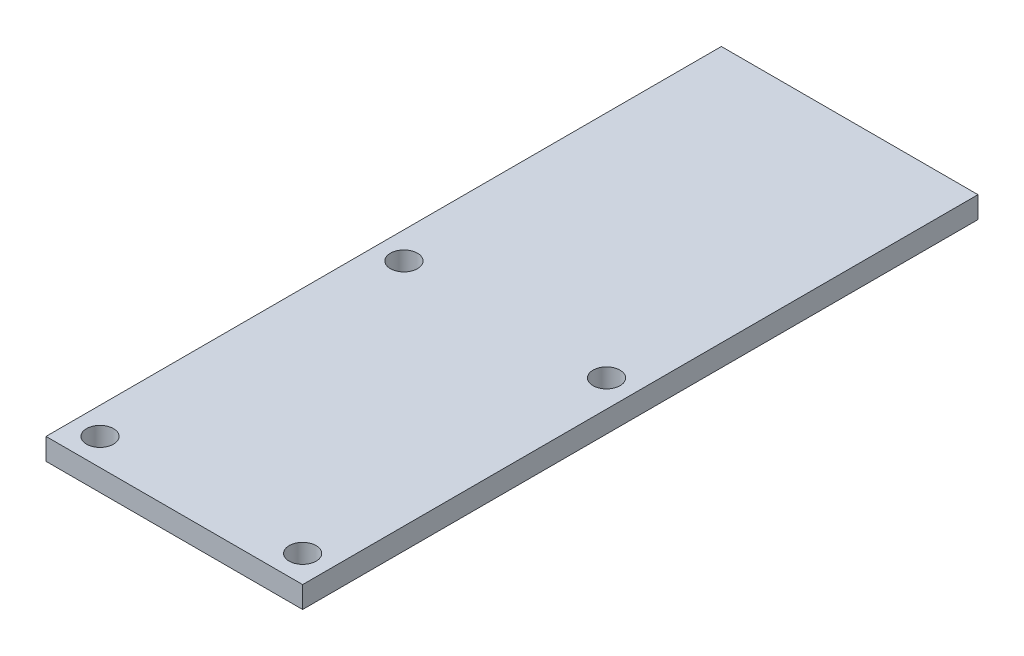
ISO-10303-21;
HEADER;
FILE_DESCRIPTION(('STEP AP214'),'2;1');
FILE_NAME('part.step','',(''),(''),'','','');
FILE_SCHEMA(('AUTOMOTIVE_DESIGN { 1 0 10303 214 1 1 1 1 }'));
ENDSEC;
DATA;
#1=APPLICATION_CONTEXT('core data for automotive mechanical design processes');
#2=APPLICATION_PROTOCOL_DEFINITION('international standard','automotive_design',2000,#1);
#3=PRODUCT_CONTEXT('',#1,'mechanical');
#4=PRODUCT('Part','Part','',(#3));
#5=PRODUCT_RELATED_PRODUCT_CATEGORY('part','',(#4));
#6=PRODUCT_DEFINITION_FORMATION('','',#4);
#7=PRODUCT_DEFINITION_CONTEXT('part definition',#1,'design');
#8=PRODUCT_DEFINITION('design','',#6,#7);
#9=PRODUCT_DEFINITION_SHAPE('','',#8);
#10=(LENGTH_UNIT() NAMED_UNIT(*) SI_UNIT(.MILLI.,.METRE.));
#11=(NAMED_UNIT(*) PLANE_ANGLE_UNIT() SI_UNIT($,.RADIAN.));
#12=(NAMED_UNIT(*) SI_UNIT($,.STERADIAN.) SOLID_ANGLE_UNIT());
#13=UNCERTAINTY_MEASURE_WITH_UNIT(LENGTH_MEASURE(1.E-05),#10,'distance_accuracy_value','');
#14=(GEOMETRIC_REPRESENTATION_CONTEXT(3) GLOBAL_UNCERTAINTY_ASSIGNED_CONTEXT((#13)) GLOBAL_UNIT_ASSIGNED_CONTEXT((#10,
#11,#12)) REPRESENTATION_CONTEXT('',''));
#15=CARTESIAN_POINT('',(0.,0.,0.));
#16=DIRECTION('',(0.,0.,1.));
#17=DIRECTION('',(1.,0.,0.));
#18=AXIS2_PLACEMENT_3D('',#15,#16,#17);
#19=CARTESIAN_POINT('',(0.,1.6,0.));
#20=DIRECTION('',(0.,-1.,0.));
#21=DIRECTION('',(0.,0.,-1.));
#22=AXIS2_PLACEMENT_3D('',#19,#20,#21);
#23=PLANE('',#22);
#24=CARTESIAN_POINT('',(17.,1.6,-24.5));
#25=DIRECTION('',(0.,1.,0.));
#26=DIRECTION('',(0.,0.,1.));
#27=AXIS2_PLACEMENT_3D('',#24,#25,#26);
#28=CIRCLE('',#27,1.);
#29=CARTESIAN_POINT('',(17.,1.6,-23.5));
#30=VERTEX_POINT('',#29);
#31=EDGE_CURVE('E125',#30,#30,#28,.T.);
#32=ORIENTED_EDGE('',*,*,#31,.F.);
#33=EDGE_LOOP('',(#32));
#34=FACE_BOUND('',#33,.T.);
#35=CARTESIAN_POINT('',(2.00000000000001,1.6,-2.00000000000001));
#36=DIRECTION('',(0.,1.,0.));
#37=DIRECTION('',(0.,0.,1.));
#38=AXIS2_PLACEMENT_3D('',#35,#36,#37);
#39=CIRCLE('',#38,1.);
#40=CARTESIAN_POINT('',(2.00000000000001,1.6,-1.00000000000001));
#41=VERTEX_POINT('',#40);
#42=EDGE_CURVE('E104',#41,#41,#39,.T.);
#43=ORIENTED_EDGE('',*,*,#42,.F.);
#44=EDGE_LOOP('',(#43));
#45=FACE_BOUND('',#44,.T.);
#46=DIRECTION('',(0.,0.,1.));
#47=VECTOR('',#46,1.);
#48=CARTESIAN_POINT('',(0.,1.6,0.));
#49=LINE('',#48,#47);
#50=CARTESIAN_POINT('',(0.,1.6,-50.));
#51=VERTEX_POINT('',#50);
#52=CARTESIAN_POINT('',(0.,1.6,0.));
#53=VERTEX_POINT('',#52);
#54=EDGE_CURVE('E89',#51,#53,#49,.T.);
#55=ORIENTED_EDGE('',*,*,#54,.T.);
#56=DIRECTION('',(1.,0.,0.));
#57=VECTOR('',#56,1.);
#58=CARTESIAN_POINT('',(0.,1.6,0.));
#59=LINE('',#58,#57);
#60=CARTESIAN_POINT('',(19.,1.6,0.));
#61=VERTEX_POINT('',#60);
#62=EDGE_CURVE('E84',#53,#61,#59,.T.);
#63=ORIENTED_EDGE('',*,*,#62,.T.);
#64=DIRECTION('',(0.,0.,-1.));
#65=VECTOR('',#64,1.);
#66=CARTESIAN_POINT('',(19.,1.6,0.));
#67=LINE('',#66,#65);
#68=CARTESIAN_POINT('',(19.,1.6,-50.));
#69=VERTEX_POINT('',#68);
#70=EDGE_CURVE('E87',#61,#69,#67,.T.);
#71=ORIENTED_EDGE('',*,*,#70,.T.);
#72=DIRECTION('',(-1.,0.,0.));
#73=VECTOR('',#72,1.);
#74=CARTESIAN_POINT('',(0.,1.6,-50.));
#75=LINE('',#74,#73);
#76=EDGE_CURVE('E54',#69,#51,#75,.T.);
#77=ORIENTED_EDGE('',*,*,#76,.T.);
#78=EDGE_LOOP('',(#55,#63,#71,#77));
#79=FACE_BOUND('',#78,.T.);
#80=CARTESIAN_POINT('',(2.,1.6,-24.5));
#81=DIRECTION('',(0.,1.,0.));
#82=DIRECTION('',(0.,0.,1.));
#83=AXIS2_PLACEMENT_3D('',#80,#81,#82);
#84=CIRCLE('',#83,1.);
#85=CARTESIAN_POINT('',(2.,1.6,-23.5));
#86=VERTEX_POINT('',#85);
#87=EDGE_CURVE('E119',#86,#86,#84,.T.);
#88=ORIENTED_EDGE('',*,*,#87,.F.);
#89=EDGE_LOOP('',(#88));
#90=FACE_BOUND('',#89,.T.);
#91=CARTESIAN_POINT('',(17.,1.6,-2.));
#92=DIRECTION('',(0.,1.,0.));
#93=DIRECTION('',(0.,0.,1.));
#94=AXIS2_PLACEMENT_3D('',#91,#92,#93);
#95=CIRCLE('',#94,1.);
#96=CARTESIAN_POINT('',(17.,1.6,-0.999999999999999));
#97=VERTEX_POINT('',#96);
#98=EDGE_CURVE('E131',#97,#97,#95,.T.);
#99=ORIENTED_EDGE('',*,*,#98,.F.);
#100=EDGE_LOOP('',(#99));
#101=FACE_BOUND('',#100,.T.);
#102=ADVANCED_FACE('F37',(#34,#45,#79,#90,#101),#23,.F.);
#103=CARTESIAN_POINT('',(0.,0.,0.));
#104=DIRECTION('',(0.,-1.,0.));
#105=DIRECTION('',(0.,0.,-1.));
#106=AXIS2_PLACEMENT_3D('',#103,#104,#105);
#107=PLANE('',#106);
#108=CARTESIAN_POINT('',(17.,0.,-24.5));
#109=DIRECTION('',(0.,1.,0.));
#110=DIRECTION('',(0.,0.,1.));
#111=AXIS2_PLACEMENT_3D('',#108,#109,#110);
#112=CIRCLE('',#111,1.);
#113=CARTESIAN_POINT('',(17.,0.,-23.5));
#114=VERTEX_POINT('',#113);
#115=EDGE_CURVE('E128',#114,#114,#112,.T.);
#116=ORIENTED_EDGE('',*,*,#115,.T.);
#117=EDGE_LOOP('',(#116));
#118=FACE_BOUND('',#117,.T.);
#119=CARTESIAN_POINT('',(2.00000000000001,0.,-2.00000000000001));
#120=DIRECTION('',(0.,1.,0.));
#121=DIRECTION('',(0.,0.,1.));
#122=AXIS2_PLACEMENT_3D('',#119,#120,#121);
#123=CIRCLE('',#122,1.);
#124=CARTESIAN_POINT('',(2.00000000000001,0.,-1.00000000000001));
#125=VERTEX_POINT('',#124);
#126=EDGE_CURVE('E116',#125,#125,#123,.T.);
#127=ORIENTED_EDGE('',*,*,#126,.T.);
#128=EDGE_LOOP('',(#127));
#129=FACE_BOUND('',#128,.T.);
#130=DIRECTION('',(0.,0.,1.));
#131=VECTOR('',#130,1.);
#132=CARTESIAN_POINT('',(0.,0.,0.));
#133=LINE('',#132,#131);
#134=CARTESIAN_POINT('',(0.,0.,-50.));
#135=VERTEX_POINT('',#134);
#136=CARTESIAN_POINT('',(0.,0.,0.));
#137=VERTEX_POINT('',#136);
#138=EDGE_CURVE('E101',#135,#137,#133,.T.);
#139=ORIENTED_EDGE('',*,*,#138,.F.);
#140=DIRECTION('',(-1.,0.,0.));
#141=VECTOR('',#140,1.);
#142=CARTESIAN_POINT('',(0.,0.,-50.));
#143=LINE('',#142,#141);
#144=CARTESIAN_POINT('',(19.,0.,-50.));
#145=VERTEX_POINT('',#144);
#146=EDGE_CURVE('E77',#145,#135,#143,.T.);
#147=ORIENTED_EDGE('',*,*,#146,.F.);
#148=DIRECTION('',(0.,0.,-1.));
#149=VECTOR('',#148,1.);
#150=CARTESIAN_POINT('',(19.,0.,0.));
#151=LINE('',#150,#149);
#152=CARTESIAN_POINT('',(19.,0.,0.));
#153=VERTEX_POINT('',#152);
#154=EDGE_CURVE('E71',#153,#145,#151,.T.);
#155=ORIENTED_EDGE('',*,*,#154,.F.);
#156=DIRECTION('',(1.,0.,0.));
#157=VECTOR('',#156,1.);
#158=CARTESIAN_POINT('',(0.,0.,0.));
#159=LINE('',#158,#157);
#160=EDGE_CURVE('E93',#137,#153,#159,.T.);
#161=ORIENTED_EDGE('',*,*,#160,.F.);
#162=EDGE_LOOP('',(#139,#147,#155,#161));
#163=FACE_BOUND('',#162,.T.);
#164=CARTESIAN_POINT('',(2.,0.,-24.5));
#165=DIRECTION('',(0.,1.,0.));
#166=DIRECTION('',(0.,0.,1.));
#167=AXIS2_PLACEMENT_3D('',#164,#165,#166);
#168=CIRCLE('',#167,1.);
#169=CARTESIAN_POINT('',(2.,0.,-23.5));
#170=VERTEX_POINT('',#169);
#171=EDGE_CURVE('E122',#170,#170,#168,.T.);
#172=ORIENTED_EDGE('',*,*,#171,.T.);
#173=EDGE_LOOP('',(#172));
#174=FACE_BOUND('',#173,.T.);
#175=CARTESIAN_POINT('',(17.,0.,-2.));
#176=DIRECTION('',(0.,1.,0.));
#177=DIRECTION('',(0.,0.,1.));
#178=AXIS2_PLACEMENT_3D('',#175,#176,#177);
#179=CIRCLE('',#178,1.);
#180=CARTESIAN_POINT('',(17.,0.,-0.999999999999999));
#181=VERTEX_POINT('',#180);
#182=EDGE_CURVE('E134',#181,#181,#179,.T.);
#183=ORIENTED_EDGE('',*,*,#182,.T.);
#184=EDGE_LOOP('',(#183));
#185=FACE_BOUND('',#184,.T.);
#186=ADVANCED_FACE('F112',(#118,#129,#163,#174,#185),#107,.T.);
#187=CARTESIAN_POINT('',(0.,1.6,0.));
#188=DIRECTION('',(1.,0.,0.));
#189=DIRECTION('',(0.,0.,-1.));
#190=AXIS2_PLACEMENT_3D('',#187,#188,#189);
#191=PLANE('',#190);
#192=ORIENTED_EDGE('',*,*,#138,.T.);
#193=DIRECTION('',(0.,-1.,0.));
#194=VECTOR('',#193,1.);
#195=CARTESIAN_POINT('',(0.,1.6,0.));
#196=LINE('',#195,#194);
#197=EDGE_CURVE('E11',#53,#137,#196,.T.);
#198=ORIENTED_EDGE('',*,*,#197,.F.);
#199=ORIENTED_EDGE('',*,*,#54,.F.);
#200=DIRECTION('',(0.,-1.,0.));
#201=VECTOR('',#200,1.);
#202=CARTESIAN_POINT('',(0.,1.6,-50.));
#203=LINE('',#202,#201);
#204=EDGE_CURVE('E97',#51,#135,#203,.T.);
#205=ORIENTED_EDGE('',*,*,#204,.T.);
#206=EDGE_LOOP('',(#192,#198,#199,#205));
#207=FACE_BOUND('',#206,.T.);
#208=ADVANCED_FACE('F39',(#207),#191,.F.);
#209=CARTESIAN_POINT('',(0.,1.6,0.));
#210=DIRECTION('',(0.,0.,-1.));
#211=DIRECTION('',(-1.,0.,0.));
#212=AXIS2_PLACEMENT_3D('',#209,#210,#211);
#213=PLANE('',#212);
#214=ORIENTED_EDGE('',*,*,#160,.T.);
#215=DIRECTION('',(0.,-1.,0.));
#216=VECTOR('',#215,1.);
#217=CARTESIAN_POINT('',(19.,1.6,0.));
#218=LINE('',#217,#216);
#219=EDGE_CURVE('E46',#61,#153,#218,.T.);
#220=ORIENTED_EDGE('',*,*,#219,.F.);
#221=ORIENTED_EDGE('',*,*,#62,.F.);
#222=ORIENTED_EDGE('',*,*,#197,.T.);
#223=EDGE_LOOP('',(#214,#220,#221,#222));
#224=FACE_BOUND('',#223,.T.);
#225=ADVANCED_FACE('F92',(#224),#213,.F.);
#226=CARTESIAN_POINT('',(19.,1.6,0.));
#227=DIRECTION('',(-1.,0.,0.));
#228=DIRECTION('',(0.,0.,1.));
#229=AXIS2_PLACEMENT_3D('',#226,#227,#228);
#230=PLANE('',#229);
#231=ORIENTED_EDGE('',*,*,#154,.T.);
#232=DIRECTION('',(0.,-1.,0.));
#233=VECTOR('',#232,1.);
#234=CARTESIAN_POINT('',(19.,1.6,-50.));
#235=LINE('',#234,#233);
#236=EDGE_CURVE('E94',#69,#145,#235,.T.);
#237=ORIENTED_EDGE('',*,*,#236,.F.);
#238=ORIENTED_EDGE('',*,*,#70,.F.);
#239=ORIENTED_EDGE('',*,*,#219,.T.);
#240=EDGE_LOOP('',(#231,#237,#238,#239));
#241=FACE_BOUND('',#240,.T.);
#242=ADVANCED_FACE('F95',(#241),#230,.F.);
#243=CARTESIAN_POINT('',(0.,1.6,-50.));
#244=DIRECTION('',(0.,0.,1.));
#245=DIRECTION('',(1.,0.,0.));
#246=AXIS2_PLACEMENT_3D('',#243,#244,#245);
#247=PLANE('',#246);
#248=ORIENTED_EDGE('',*,*,#146,.T.);
#249=ORIENTED_EDGE('',*,*,#204,.F.);
#250=ORIENTED_EDGE('',*,*,#76,.F.);
#251=ORIENTED_EDGE('',*,*,#236,.T.);
#252=EDGE_LOOP('',(#248,#249,#250,#251));
#253=FACE_BOUND('',#252,.T.);
#254=ADVANCED_FACE('F109',(#253),#247,.F.);
#255=CARTESIAN_POINT('',(2.00000000000001,1.6,-2.00000000000001));
#256=DIRECTION('',(0.,-1.,0.));
#257=DIRECTION('',(0.,0.,-1.));
#258=AXIS2_PLACEMENT_3D('',#255,#256,#257);
#259=CYLINDRICAL_SURFACE('',#258,1.);
#260=ORIENTED_EDGE('',*,*,#42,.T.);
#261=EDGE_LOOP('',(#260));
#262=FACE_BOUND('',#261,.T.);
#263=ORIENTED_EDGE('',*,*,#126,.F.);
#264=EDGE_LOOP('',(#263));
#265=FACE_BOUND('',#264,.T.);
#266=ADVANCED_FACE('F154',(#262,#265),#259,.F.);
#267=CARTESIAN_POINT('',(2.,1.6,-24.5));
#268=DIRECTION('',(0.,-1.,0.));
#269=DIRECTION('',(0.,0.,-1.));
#270=AXIS2_PLACEMENT_3D('',#267,#268,#269);
#271=CYLINDRICAL_SURFACE('',#270,1.);
#272=ORIENTED_EDGE('',*,*,#87,.T.);
#273=EDGE_LOOP('',(#272));
#274=FACE_BOUND('',#273,.T.);
#275=ORIENTED_EDGE('',*,*,#171,.F.);
#276=EDGE_LOOP('',(#275));
#277=FACE_BOUND('',#276,.T.);
#278=ADVANCED_FACE('F200',(#274,#277),#271,.F.);
#279=CARTESIAN_POINT('',(17.,1.6,-24.5));
#280=DIRECTION('',(0.,-1.,0.));
#281=DIRECTION('',(0.,0.,-1.));
#282=AXIS2_PLACEMENT_3D('',#279,#280,#281);
#283=CYLINDRICAL_SURFACE('',#282,1.);
#284=ORIENTED_EDGE('',*,*,#31,.T.);
#285=EDGE_LOOP('',(#284));
#286=FACE_BOUND('',#285,.T.);
#287=ORIENTED_EDGE('',*,*,#115,.F.);
#288=EDGE_LOOP('',(#287));
#289=FACE_BOUND('',#288,.T.);
#290=ADVANCED_FACE('F208',(#286,#289),#283,.F.);
#291=CARTESIAN_POINT('',(17.,1.6,-2.));
#292=DIRECTION('',(0.,-1.,0.));
#293=DIRECTION('',(0.,0.,-1.));
#294=AXIS2_PLACEMENT_3D('',#291,#292,#293);
#295=CYLINDRICAL_SURFACE('',#294,1.);
#296=ORIENTED_EDGE('',*,*,#98,.T.);
#297=EDGE_LOOP('',(#296));
#298=FACE_BOUND('',#297,.T.);
#299=ORIENTED_EDGE('',*,*,#182,.F.);
#300=EDGE_LOOP('',(#299));
#301=FACE_BOUND('',#300,.T.);
#302=ADVANCED_FACE('F140',(#298,#301),#295,.F.);
#303=CLOSED_SHELL('',(#102,#186,#208,#225,#242,#254,#266,#278,#290,#302));
#304=MANIFOLD_SOLID_BREP('B2',#303);
#305=ADVANCED_BREP_SHAPE_REPRESENTATION('',(#18,#304),#14);
#306=SHAPE_DEFINITION_REPRESENTATION(#9,#305);
ENDSEC;
END-ISO-10303-21;
